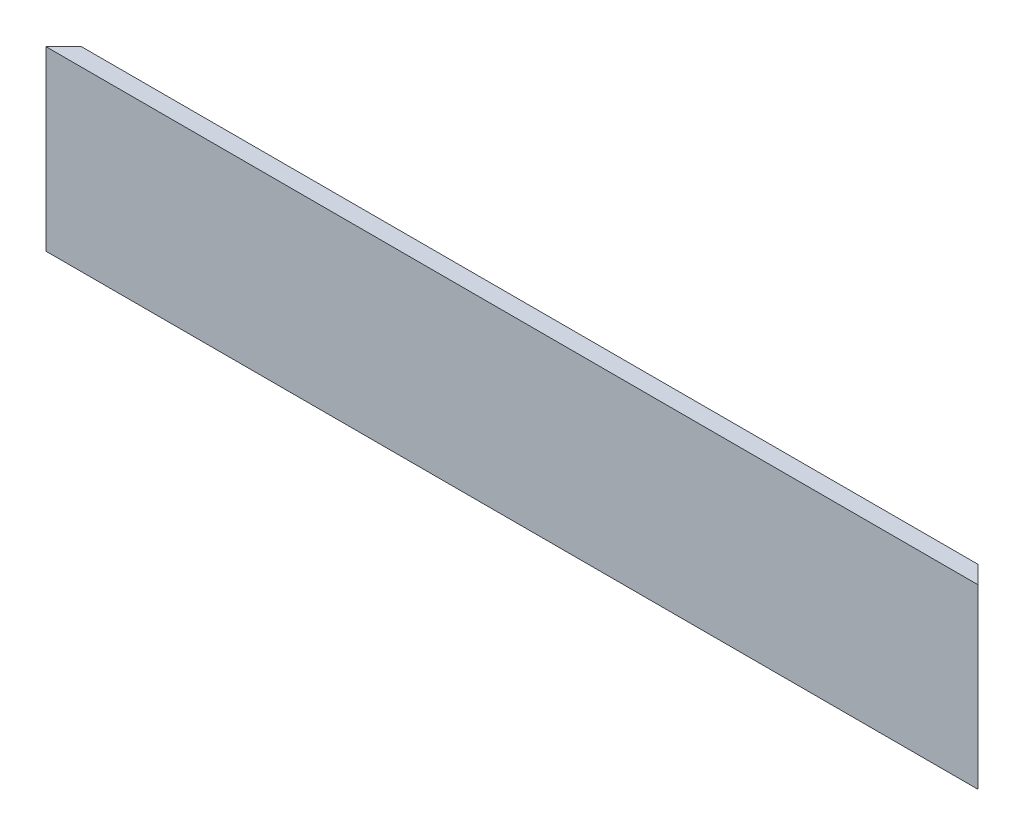
ISO-10303-21;
HEADER;
FILE_DESCRIPTION(('STEP AP214'),'2;1');
FILE_NAME('part.step','',(''),(''),'','','');
FILE_SCHEMA(('AUTOMOTIVE_DESIGN { 1 0 10303 214 1 1 1 1 }'));
ENDSEC;
DATA;
#1=APPLICATION_CONTEXT('core data for automotive mechanical design processes');
#2=APPLICATION_PROTOCOL_DEFINITION('international standard','automotive_design',2000,#1);
#3=PRODUCT_CONTEXT('',#1,'mechanical');
#4=PRODUCT('Part','Part','',(#3));
#5=PRODUCT_RELATED_PRODUCT_CATEGORY('part','',(#4));
#6=PRODUCT_DEFINITION_FORMATION('','',#4);
#7=PRODUCT_DEFINITION_CONTEXT('part definition',#1,'design');
#8=PRODUCT_DEFINITION('design','',#6,#7);
#9=PRODUCT_DEFINITION_SHAPE('','',#8);
#10=(LENGTH_UNIT() NAMED_UNIT(*) SI_UNIT(.MILLI.,.METRE.));
#11=(NAMED_UNIT(*) PLANE_ANGLE_UNIT() SI_UNIT($,.RADIAN.));
#12=(NAMED_UNIT(*) SI_UNIT($,.STERADIAN.) SOLID_ANGLE_UNIT());
#13=UNCERTAINTY_MEASURE_WITH_UNIT(LENGTH_MEASURE(1.E-05),#10,'distance_accuracy_value','');
#14=(GEOMETRIC_REPRESENTATION_CONTEXT(3) GLOBAL_UNCERTAINTY_ASSIGNED_CONTEXT((#13)) GLOBAL_UNIT_ASSIGNED_CONTEXT((#10,
#11,#12)) REPRESENTATION_CONTEXT('',''));
#15=CARTESIAN_POINT('',(0.,0.,0.));
#16=DIRECTION('',(0.,0.,1.));
#17=DIRECTION('',(1.,0.,0.));
#18=AXIS2_PLACEMENT_3D('',#15,#16,#17);
#19=CARTESIAN_POINT('',(-263.,100.,-5.));
#20=DIRECTION('',(0.,0.,1.));
#21=DIRECTION('',(1.,0.,0.));
#22=AXIS2_PLACEMENT_3D('',#19,#20,#21);
#23=PLANE('',#22);
#24=DIRECTION('',(0.,1.,0.));
#25=VECTOR('',#24,1.);
#26=CARTESIAN_POINT('',(253.,0.,-5.));
#27=LINE('',#26,#25);
#28=CARTESIAN_POINT('',(253.,98.75,-5.));
#29=VERTEX_POINT('',#28);
#30=CARTESIAN_POINT('',(253.,100.,-5.));
#31=VERTEX_POINT('',#30);
#32=EDGE_CURVE('E124',#29,#31,#27,.T.);
#33=ORIENTED_EDGE('',*,*,#32,.F.);
#34=DIRECTION('',(1.,0.,0.));
#35=VECTOR('',#34,1.);
#36=CARTESIAN_POINT('',(263.,98.75,-5.));
#37=LINE('',#36,#35);
#38=CARTESIAN_POINT('',(-253.,98.75,-5.));
#39=VERTEX_POINT('',#38);
#40=EDGE_CURVE('E118',#39,#29,#37,.T.);
#41=ORIENTED_EDGE('',*,*,#40,.F.);
#42=DIRECTION('',(0.,1.,0.));
#43=VECTOR('',#42,1.);
#44=CARTESIAN_POINT('',(-253.,0.,-5.));
#45=LINE('',#44,#43);
#46=CARTESIAN_POINT('',(-253.,100.,-5.));
#47=VERTEX_POINT('',#46);
#48=EDGE_CURVE('E167',#39,#47,#45,.T.);
#49=ORIENTED_EDGE('',*,*,#48,.T.);
#50=DIRECTION('',(-1.,0.,0.));
#51=VECTOR('',#50,1.);
#52=CARTESIAN_POINT('',(-263.,100.,-5.));
#53=LINE('',#52,#51);
#54=EDGE_CURVE('E133',#31,#47,#53,.T.);
#55=ORIENTED_EDGE('',*,*,#54,.F.);
#56=EDGE_LOOP('',(#33,#41,#49,#55));
#57=FACE_BOUND('',#56,.T.);
#58=ADVANCED_FACE('F38',(#57),#23,.F.);
#59=CARTESIAN_POINT('',(-253.,0.,-4.99999999999997));
#60=VERTEX_POINT('',#59);
#61=CARTESIAN_POINT('',(-253.,1.25,-5.));
#62=VERTEX_POINT('',#61);
#63=EDGE_CURVE('E61',#60,#62,#45,.T.);
#64=ORIENTED_EDGE('',*,*,#63,.T.);
#65=DIRECTION('',(-1.,0.,0.));
#66=VECTOR('',#65,1.);
#67=CARTESIAN_POINT('',(263.,1.25,-5.));
#68=LINE('',#67,#66);
#69=CARTESIAN_POINT('',(253.,1.25,-5.));
#70=VERTEX_POINT('',#69);
#71=EDGE_CURVE('E106',#70,#62,#68,.T.);
#72=ORIENTED_EDGE('',*,*,#71,.F.);
#73=CARTESIAN_POINT('',(253.,0.,-5.));
#74=VERTEX_POINT('',#73);
#75=EDGE_CURVE('E116',#74,#70,#27,.T.);
#76=ORIENTED_EDGE('',*,*,#75,.F.);
#77=DIRECTION('',(-1.,0.,0.));
#78=VECTOR('',#77,1.);
#79=CARTESIAN_POINT('',(-263.,0.,-5.));
#80=LINE('',#79,#78);
#81=EDGE_CURVE('E141',#74,#60,#80,.T.);
#82=ORIENTED_EDGE('',*,*,#81,.T.);
#83=EDGE_LOOP('',(#64,#72,#76,#82));
#84=FACE_BOUND('',#83,.T.);
#85=ADVANCED_FACE('F40',(#84),#23,.F.);
#86=CARTESIAN_POINT('',(-263.,100.,5.));
#87=DIRECTION('',(0.,0.,-1.));
#88=DIRECTION('',(-1.,0.,0.));
#89=AXIS2_PLACEMENT_3D('',#86,#87,#88);
#90=PLANE('',#89);
#91=DIRECTION('',(1.,0.,0.));
#92=VECTOR('',#91,1.);
#93=CARTESIAN_POINT('',(-263.,0.,5.));
#94=LINE('',#93,#92);
#95=CARTESIAN_POINT('',(-263.,0.,5.));
#96=VERTEX_POINT('',#95);
#97=CARTESIAN_POINT('',(263.,0.,5.));
#98=VERTEX_POINT('',#97);
#99=EDGE_CURVE('E137',#96,#98,#94,.T.);
#100=ORIENTED_EDGE('',*,*,#99,.T.);
#101=DIRECTION('',(0.,-1.,0.));
#102=VECTOR('',#101,1.);
#103=CARTESIAN_POINT('',(263.,100.,5.));
#104=LINE('',#103,#102);
#105=CARTESIAN_POINT('',(263.,100.,5.));
#106=VERTEX_POINT('',#105);
#107=EDGE_CURVE('E140',#106,#98,#104,.T.);
#108=ORIENTED_EDGE('',*,*,#107,.F.);
#109=DIRECTION('',(1.,0.,0.));
#110=VECTOR('',#109,1.);
#111=CARTESIAN_POINT('',(-263.,100.,5.));
#112=LINE('',#111,#110);
#113=CARTESIAN_POINT('',(-263.,100.,5.));
#114=VERTEX_POINT('',#113);
#115=EDGE_CURVE('E136',#114,#106,#112,.T.);
#116=ORIENTED_EDGE('',*,*,#115,.F.);
#117=DIRECTION('',(0.,-1.,0.));
#118=VECTOR('',#117,1.);
#119=CARTESIAN_POINT('',(-263.,100.,5.));
#120=LINE('',#119,#118);
#121=EDGE_CURVE('E146',#114,#96,#120,.T.);
#122=ORIENTED_EDGE('',*,*,#121,.T.);
#123=EDGE_LOOP('',(#100,#108,#116,#122));
#124=FACE_BOUND('',#123,.T.);
#125=ADVANCED_FACE('F180',(#124),#90,.F.);
#126=CARTESIAN_POINT('',(0.,100.,0.));
#127=DIRECTION('',(0.,1.,0.));
#128=DIRECTION('',(0.,0.,1.));
#129=AXIS2_PLACEMENT_3D('',#126,#127,#128);
#130=PLANE('',#129);
#131=DIRECTION('',(0.707106781186546,0.,-0.707106781186549));
#132=VECTOR('',#131,1.);
#133=CARTESIAN_POINT('',(-263.,100.,5.));
#134=LINE('',#133,#132);
#135=EDGE_CURVE('E123',#114,#47,#134,.T.);
#136=ORIENTED_EDGE('',*,*,#135,.F.);
#137=ORIENTED_EDGE('',*,*,#115,.T.);
#138=DIRECTION('',(0.707106781186546,0.,0.707106781186549));
#139=VECTOR('',#138,1.);
#140=CARTESIAN_POINT('',(263.,100.,5.));
#141=LINE('',#140,#139);
#142=EDGE_CURVE('E131',#31,#106,#141,.T.);
#143=ORIENTED_EDGE('',*,*,#142,.F.);
#144=ORIENTED_EDGE('',*,*,#54,.T.);
#145=EDGE_LOOP('',(#136,#137,#143,#144));
#146=FACE_BOUND('',#145,.T.);
#147=ADVANCED_FACE('F178',(#146),#130,.T.);
#148=CARTESIAN_POINT('',(0.,0.,0.));
#149=DIRECTION('',(0.,1.,0.));
#150=DIRECTION('',(0.,0.,1.));
#151=AXIS2_PLACEMENT_3D('',#148,#149,#150);
#152=PLANE('',#151);
#153=ORIENTED_EDGE('',*,*,#99,.F.);
#154=DIRECTION('',(0.707106781186546,0.,-0.707106781186549));
#155=VECTOR('',#154,1.);
#156=CARTESIAN_POINT('',(-263.,0.,5.));
#157=LINE('',#156,#155);
#158=EDGE_CURVE('E127',#96,#60,#157,.T.);
#159=ORIENTED_EDGE('',*,*,#158,.T.);
#160=ORIENTED_EDGE('',*,*,#81,.F.);
#161=DIRECTION('',(0.707106781186546,0.,0.707106781186549));
#162=VECTOR('',#161,1.);
#163=CARTESIAN_POINT('',(263.,0.,5.));
#164=LINE('',#163,#162);
#165=EDGE_CURVE('E122',#74,#98,#164,.T.);
#166=ORIENTED_EDGE('',*,*,#165,.T.);
#167=EDGE_LOOP('',(#153,#159,#160,#166));
#168=FACE_BOUND('',#167,.T.);
#169=ADVANCED_FACE('F181',(#168),#152,.F.);
#170=CARTESIAN_POINT('',(263.,0.,5.));
#171=DIRECTION('',(-0.707106781186549,0.,0.707106781186546));
#172=DIRECTION('',(0.707106781186546,0.,0.707106781186549));
#173=AXIS2_PLACEMENT_3D('',#170,#171,#172);
#174=PLANE('',#173);
#175=DIRECTION('',(0.,-1.,0.));
#176=VECTOR('',#175,1.);
#177=CARTESIAN_POINT('',(262.25,0.,4.25));
#178=LINE('',#177,#176);
#179=CARTESIAN_POINT('',(262.25,98.75,4.25));
#180=VERTEX_POINT('',#179);
#181=CARTESIAN_POINT('',(262.25,1.25,4.25));
#182=VERTEX_POINT('',#181);
#183=EDGE_CURVE('E111',#180,#182,#178,.T.);
#184=ORIENTED_EDGE('',*,*,#183,.F.);
#185=DIRECTION('',(-0.707106781186546,0.,-0.707106781186549));
#186=VECTOR('',#185,1.);
#187=CARTESIAN_POINT('',(263.,98.75,5.));
#188=LINE('',#187,#186);
#189=EDGE_CURVE('E110',#180,#29,#188,.T.);
#190=ORIENTED_EDGE('',*,*,#189,.T.);
#191=ORIENTED_EDGE('',*,*,#32,.T.);
#192=ORIENTED_EDGE('',*,*,#142,.T.);
#193=ORIENTED_EDGE('',*,*,#107,.T.);
#194=ORIENTED_EDGE('',*,*,#165,.F.);
#195=ORIENTED_EDGE('',*,*,#75,.T.);
#196=DIRECTION('',(0.707106781186546,0.,0.707106781186549));
#197=VECTOR('',#196,1.);
#198=CARTESIAN_POINT('',(263.,1.25,5.));
#199=LINE('',#198,#197);
#200=EDGE_CURVE('E103',#70,#182,#199,.T.);
#201=ORIENTED_EDGE('',*,*,#200,.T.);
#202=EDGE_LOOP('',(#184,#190,#191,#192,#193,#194,#195,#201));
#203=FACE_BOUND('',#202,.T.);
#204=ADVANCED_FACE('F120',(#203),#174,.F.);
#205=CARTESIAN_POINT('',(-263.,0.,5.));
#206=DIRECTION('',(0.707106781186549,0.,0.707106781186546));
#207=DIRECTION('',(0.707106781186546,0.,-0.707106781186549));
#208=AXIS2_PLACEMENT_3D('',#205,#206,#207);
#209=PLANE('',#208);
#210=ORIENTED_EDGE('',*,*,#48,.F.);
#211=DIRECTION('',(-0.707106781186546,0.,0.707106781186549));
#212=VECTOR('',#211,1.);
#213=CARTESIAN_POINT('',(-263.,98.75,5.));
#214=LINE('',#213,#212);
#215=CARTESIAN_POINT('',(-262.25,98.75,4.25));
#216=VERTEX_POINT('',#215);
#217=EDGE_CURVE('E11',#39,#216,#214,.T.);
#218=ORIENTED_EDGE('',*,*,#217,.T.);
#219=DIRECTION('',(0.,1.,0.));
#220=VECTOR('',#219,1.);
#221=CARTESIAN_POINT('',(-262.25,0.,4.25));
#222=LINE('',#221,#220);
#223=CARTESIAN_POINT('',(-262.25,1.25,4.25));
#224=VERTEX_POINT('',#223);
#225=EDGE_CURVE('E149',#224,#216,#222,.T.);
#226=ORIENTED_EDGE('',*,*,#225,.F.);
#227=DIRECTION('',(0.707106781186546,0.,-0.707106781186549));
#228=VECTOR('',#227,1.);
#229=CARTESIAN_POINT('',(-263.,1.25,5.));
#230=LINE('',#229,#228);
#231=EDGE_CURVE('E46',#224,#62,#230,.T.);
#232=ORIENTED_EDGE('',*,*,#231,.T.);
#233=ORIENTED_EDGE('',*,*,#63,.F.);
#234=ORIENTED_EDGE('',*,*,#158,.F.);
#235=ORIENTED_EDGE('',*,*,#121,.F.);
#236=ORIENTED_EDGE('',*,*,#135,.T.);
#237=EDGE_LOOP('',(#210,#218,#226,#232,#233,#234,#235,#236));
#238=FACE_BOUND('',#237,.T.);
#239=ADVANCED_FACE('F152',(#238),#209,.F.);
#240=CARTESIAN_POINT('',(263.,98.75,4.25));
#241=DIRECTION('',(0.,1.,0.));
#242=DIRECTION('',(0.,0.,1.));
#243=AXIS2_PLACEMENT_3D('',#240,#241,#242);
#244=PLANE('',#243);
#245=DIRECTION('',(1.,0.,0.));
#246=VECTOR('',#245,1.);
#247=CARTESIAN_POINT('',(263.,98.75,4.25));
#248=LINE('',#247,#246);
#249=EDGE_CURVE('E156',#216,#180,#248,.T.);
#250=ORIENTED_EDGE('',*,*,#249,.F.);
#251=ORIENTED_EDGE('',*,*,#217,.F.);
#252=ORIENTED_EDGE('',*,*,#40,.T.);
#253=ORIENTED_EDGE('',*,*,#189,.F.);
#254=EDGE_LOOP('',(#250,#251,#252,#253));
#255=FACE_BOUND('',#254,.T.);
#256=ADVANCED_FACE('F158',(#255),#244,.F.);
#257=CARTESIAN_POINT('',(263.,1.25,4.25));
#258=DIRECTION('',(0.,-1.,0.));
#259=DIRECTION('',(1.,0.,0.));
#260=AXIS2_PLACEMENT_3D('',#257,#258,#259);
#261=PLANE('',#260);
#262=ORIENTED_EDGE('',*,*,#71,.T.);
#263=ORIENTED_EDGE('',*,*,#231,.F.);
#264=DIRECTION('',(-1.,0.,0.));
#265=VECTOR('',#264,1.);
#266=CARTESIAN_POINT('',(263.,1.25,4.25));
#267=LINE('',#266,#265);
#268=EDGE_CURVE('E53',#182,#224,#267,.T.);
#269=ORIENTED_EDGE('',*,*,#268,.F.);
#270=ORIENTED_EDGE('',*,*,#200,.F.);
#271=EDGE_LOOP('',(#262,#263,#269,#270));
#272=FACE_BOUND('',#271,.T.);
#273=ADVANCED_FACE('F105',(#272),#261,.F.);
#274=CARTESIAN_POINT('',(0.,0.,4.25));
#275=DIRECTION('',(0.,0.,-1.));
#276=DIRECTION('',(-1.,0.,0.));
#277=AXIS2_PLACEMENT_3D('',#274,#275,#276);
#278=PLANE('',#277);
#279=ORIENTED_EDGE('',*,*,#183,.T.);
#280=ORIENTED_EDGE('',*,*,#268,.T.);
#281=ORIENTED_EDGE('',*,*,#225,.T.);
#282=ORIENTED_EDGE('',*,*,#249,.T.);
#283=EDGE_LOOP('',(#279,#280,#281,#282));
#284=FACE_BOUND('',#283,.T.);
#285=ADVANCED_FACE('F155',(#284),#278,.T.);
#286=CLOSED_SHELL('',(#58,#85,#125,#147,#169,#204,#239,#256,#273,#285));
#287=MANIFOLD_SOLID_BREP('B2',#286);
#288=ADVANCED_BREP_SHAPE_REPRESENTATION('',(#18,#287),#14);
#289=SHAPE_DEFINITION_REPRESENTATION(#9,#288);
ENDSEC;
END-ISO-10303-21;
